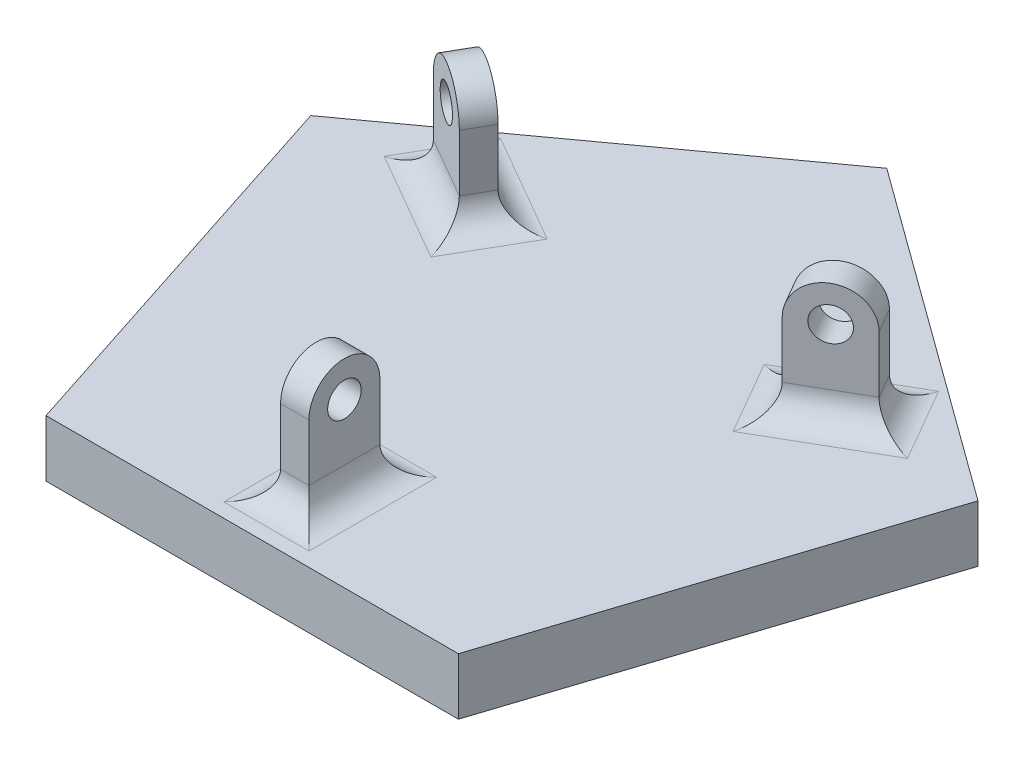
ISO-10303-21;
HEADER;
FILE_DESCRIPTION(('STEP AP214'),'2;1');
FILE_NAME('part.step','',(''),(''),'','','');
FILE_SCHEMA(('AUTOMOTIVE_DESIGN { 1 0 10303 214 1 1 1 1 }'));
ENDSEC;
DATA;
#1=APPLICATION_CONTEXT('core data for automotive mechanical design processes');
#2=APPLICATION_PROTOCOL_DEFINITION('international standard','automotive_design',2000,#1);
#3=PRODUCT_CONTEXT('',#1,'mechanical');
#4=PRODUCT('Part','Part','',(#3));
#5=PRODUCT_RELATED_PRODUCT_CATEGORY('part','',(#4));
#6=PRODUCT_DEFINITION_FORMATION('','',#4);
#7=PRODUCT_DEFINITION_CONTEXT('part definition',#1,'design');
#8=PRODUCT_DEFINITION('design','',#6,#7);
#9=PRODUCT_DEFINITION_SHAPE('','',#8);
#10=(LENGTH_UNIT() NAMED_UNIT(*) SI_UNIT(.MILLI.,.METRE.));
#11=(NAMED_UNIT(*) PLANE_ANGLE_UNIT() SI_UNIT($,.RADIAN.));
#12=(NAMED_UNIT(*) SI_UNIT($,.STERADIAN.) SOLID_ANGLE_UNIT());
#13=UNCERTAINTY_MEASURE_WITH_UNIT(LENGTH_MEASURE(1.E-05),#10,'distance_accuracy_value','');
#14=(GEOMETRIC_REPRESENTATION_CONTEXT(3) GLOBAL_UNCERTAINTY_ASSIGNED_CONTEXT((#13)) GLOBAL_UNIT_ASSIGNED_CONTEXT((#10,
#11,#12)) REPRESENTATION_CONTEXT('',''));
#15=CARTESIAN_POINT('',(0.,0.,0.));
#16=DIRECTION('',(0.,0.,1.));
#17=DIRECTION('',(1.,0.,0.));
#18=AXIS2_PLACEMENT_3D('',#15,#16,#17);
#19=CARTESIAN_POINT('',(0.,5.08,0.));
#20=DIRECTION('',(0.,1.,0.));
#21=DIRECTION('',(0.,0.,1.));
#22=AXIS2_PLACEMENT_3D('',#19,#20,#21);
#23=PLANE('',#22);
#24=DIRECTION('',(0.866025403784443,0.,0.499999999999992));
#25=VECTOR('',#24,1.);
#26=CARTESIAN_POINT('',(2.21276696458781,5.08,-3.83262480797613));
#27=LINE('',#26,#25);
#28=CARTESIAN_POINT('',(-19.6077269224943,5.08,-16.4306928275333));
#29=VERTEX_POINT('',#28);
#30=CARTESIAN_POINT('',(-9.70905655723815,5.08,-10.7156928275334));
#31=VERTEX_POINT('',#30);
#32=EDGE_CURVE('E463',#29,#31,#27,.T.);
#33=ORIENTED_EDGE('',*,*,#32,.T.);
#34=DIRECTION('',(-0.499999999999992,0.,0.866025403784443));
#35=VECTOR('',#34,1.);
#36=CARTESIAN_POINT('',(-11.921823521826,5.08,-6.88306801955729));
#37=LINE('',#36,#35);
#38=CARTESIAN_POINT('',(-13.5190565572381,5.08,-4.11657925069596));
#39=VERTEX_POINT('',#38);
#40=EDGE_CURVE('E466',#31,#39,#37,.T.);
#41=ORIENTED_EDGE('',*,*,#40,.T.);
#42=DIRECTION('',(0.866025403784443,0.,0.499999999999992));
#43=VECTOR('',#42,1.);
#44=CARTESIAN_POINT('',(-21.2180223968818,5.08,-8.56157925069589));
#45=LINE('',#44,#43);
#46=CARTESIAN_POINT('',(-23.4177269224943,5.08,-9.83157925069587));
#47=VERTEX_POINT('',#46);
#48=EDGE_CURVE('E444',#39,#47,#45,.F.);
#49=ORIENTED_EDGE('',*,*,#48,.T.);
#50=DIRECTION('',(-0.499999999999992,0.,0.866025403784443));
#51=VECTOR('',#50,1.);
#52=CARTESIAN_POINT('',(-21.8204938870821,5.08,-12.5980680195572));
#53=LINE('',#52,#51);
#54=EDGE_CURVE('E460',#47,#29,#53,.F.);
#55=ORIENTED_EDGE('',*,*,#54,.T.);
#56=EDGE_LOOP('',(#33,#41,#49,#55));
#57=FACE_BOUND('',#56,.T.);
#58=DIRECTION('',(-0.866025403784436,0.,0.500000000000004));
#59=VECTOR('',#58,1.);
#60=CARTESIAN_POINT('',(1.59723303541216,5.08,2.7664887688613));
#61=LINE('',#60,#59);
#62=CARTESIAN_POINT('',(23.4177269224941,5.08,-9.8315792506962));
#63=VERTEX_POINT('',#62);
#64=CARTESIAN_POINT('',(13.519056557238,5.08,-4.11657925069616));
#65=VERTEX_POINT('',#64);
#66=EDGE_CURVE('E424',#63,#65,#61,.T.);
#67=ORIENTED_EDGE('',*,*,#66,.T.);
#68=DIRECTION('',(-0.500000000000004,0.,-0.866025403784436));
#69=VECTOR('',#68,1.);
#70=CARTESIAN_POINT('',(11.9218235218259,5.08,-6.88306801955745));
#71=LINE('',#70,#69);
#72=CARTESIAN_POINT('',(9.70905655723801,5.08,-10.7156928275336));
#73=VERTEX_POINT('',#72);
#74=EDGE_CURVE('E427',#65,#73,#71,.T.);
#75=ORIENTED_EDGE('',*,*,#74,.T.);
#76=DIRECTION('',(-0.866025403784436,0.,0.500000000000004));
#77=VECTOR('',#76,1.);
#78=CARTESIAN_POINT('',(17.4080223968816,5.08,-15.1606928275336));
#79=LINE('',#78,#77);
#80=CARTESIAN_POINT('',(19.6077269224941,5.08,-16.4306928275336));
#81=VERTEX_POINT('',#80);
#82=EDGE_CURVE('E406',#73,#81,#79,.F.);
#83=ORIENTED_EDGE('',*,*,#82,.T.);
#84=DIRECTION('',(-0.500000000000004,0.,-0.866025403784436));
#85=VECTOR('',#84,1.);
#86=CARTESIAN_POINT('',(21.820493887082,5.08,-12.5980680195575));
#87=LINE('',#86,#85);
#88=EDGE_CURVE('E421',#81,#63,#87,.F.);
#89=ORIENTED_EDGE('',*,*,#88,.T.);
#90=EDGE_LOOP('',(#67,#75,#83,#89));
#91=FACE_BOUND('',#90,.T.);
#92=DIRECTION('',(0.,0.,-1.));
#93=VECTOR('',#92,1.);
#94=CARTESIAN_POINT('',(-3.81,5.08,0.));
#95=LINE('',#94,#93);
#96=CARTESIAN_POINT('',(-3.81,5.08,24.13));
#97=VERTEX_POINT('',#96);
#98=CARTESIAN_POINT('',(-3.81,5.08,12.7));
#99=VERTEX_POINT('',#98);
#100=EDGE_CURVE('E386',#97,#99,#95,.T.);
#101=ORIENTED_EDGE('',*,*,#100,.T.);
#102=DIRECTION('',(1.,0.,0.));
#103=VECTOR('',#102,1.);
#104=CARTESIAN_POINT('',(0.,5.08,12.7));
#105=LINE('',#104,#103);
#106=CARTESIAN_POINT('',(3.81,5.08,12.7));
#107=VERTEX_POINT('',#106);
#108=EDGE_CURVE('E389',#99,#107,#105,.T.);
#109=ORIENTED_EDGE('',*,*,#108,.T.);
#110=DIRECTION('',(0.,0.,-1.));
#111=VECTOR('',#110,1.);
#112=CARTESIAN_POINT('',(3.81,5.08,21.59));
#113=LINE('',#112,#111);
#114=CARTESIAN_POINT('',(3.81,5.08,24.13));
#115=VERTEX_POINT('',#114);
#116=EDGE_CURVE('E380',#107,#115,#113,.F.);
#117=ORIENTED_EDGE('',*,*,#116,.T.);
#118=DIRECTION('',(1.,0.,0.));
#119=VECTOR('',#118,1.);
#120=CARTESIAN_POINT('',(0.,5.08,24.13));
#121=LINE('',#120,#119);
#122=EDGE_CURVE('E383',#115,#97,#121,.F.);
#123=ORIENTED_EDGE('',*,*,#122,.T.);
#124=EDGE_LOOP('',(#101,#109,#117,#123));
#125=FACE_BOUND('',#124,.T.);
#126=DIRECTION('',(0.309016994374947,0.,0.951056516295154));
#127=VECTOR('',#126,1.);
#128=CARTESIAN_POINT('',(-24.1568355138969,5.08,7.84903165712366));
#129=LINE('',#128,#127);
#130=CARTESIAN_POINT('',(-29.8594908164576,5.08,-9.70193668575268));
#131=VERTEX_POINT('',#130);
#132=CARTESIAN_POINT('',(-18.4541802113362,5.08,25.4));
#133=VERTEX_POINT('',#132);
#134=EDGE_CURVE('E329',#131,#133,#129,.T.);
#135=ORIENTED_EDGE('',*,*,#134,.T.);
#136=DIRECTION('',(1.,0.,0.));
#137=VECTOR('',#136,1.);
#138=CARTESIAN_POINT('',(0.,5.08,25.4));
#139=LINE('',#138,#137);
#140=CARTESIAN_POINT('',(18.4541802113362,5.08,25.4));
#141=VERTEX_POINT('',#140);
#142=EDGE_CURVE('E333',#133,#141,#139,.T.);
#143=ORIENTED_EDGE('',*,*,#142,.T.);
#144=DIRECTION('',(0.309016994374947,0.,-0.951056516295154));
#145=VECTOR('',#144,1.);
#146=CARTESIAN_POINT('',(24.1568355138969,5.08,7.84903165712367));
#147=LINE('',#146,#145);
#148=CARTESIAN_POINT('',(29.8594908164576,5.08,-9.70193668575266));
#149=VERTEX_POINT('',#148);
#150=EDGE_CURVE('E337',#141,#149,#147,.T.);
#151=ORIENTED_EDGE('',*,*,#150,.T.);
#152=DIRECTION('',(-0.809016994374948,0.,-0.587785252292473));
#153=VECTOR('',#152,1.);
#154=CARTESIAN_POINT('',(14.9297454082288,5.08,-20.5490316571237));
#155=LINE('',#154,#153);
#156=CARTESIAN_POINT('',(0.,5.08,-31.3961266284946));
#157=VERTEX_POINT('',#156);
#158=EDGE_CURVE('E340',#149,#157,#155,.T.);
#159=ORIENTED_EDGE('',*,*,#158,.T.);
#160=DIRECTION('',(-0.809016994374948,0.,0.587785252292473));
#161=VECTOR('',#160,1.);
#162=CARTESIAN_POINT('',(-14.9297454082288,5.08,-20.5490316571237));
#163=LINE('',#162,#161);
#164=EDGE_CURVE('E343',#157,#131,#163,.T.);
#165=ORIENTED_EDGE('',*,*,#164,.T.);
#166=EDGE_LOOP('',(#135,#143,#151,#159,#165));
#167=FACE_BOUND('',#166,.T.);
#168=ADVANCED_FACE('F46',(#57,#91,#125,#167),#23,.T.);
#169=CARTESIAN_POINT('',(-24.1568355138969,5.08,7.84903165712366));
#170=DIRECTION('',(0.951056516295154,0.,-0.309016994374947));
#171=DIRECTION('',(-0.309016994374947,0.,-0.951056516295154));
#172=AXIS2_PLACEMENT_3D('',#169,#170,#171);
#173=PLANE('',#172);
#174=DIRECTION('',(0.309016994374947,0.,0.951056516295154));
#175=VECTOR('',#174,1.);
#176=CARTESIAN_POINT('',(-24.1568355138969,0.,7.84903165712366));
#177=LINE('',#176,#175);
#178=CARTESIAN_POINT('',(-29.8594908164576,0.,-9.70193668575268));
#179=VERTEX_POINT('',#178);
#180=CARTESIAN_POINT('',(-18.4541802113362,0.,25.4));
#181=VERTEX_POINT('',#180);
#182=EDGE_CURVE('E326',#179,#181,#177,.T.);
#183=ORIENTED_EDGE('',*,*,#182,.T.);
#184=DIRECTION('',(0.,-1.,0.));
#185=VECTOR('',#184,1.);
#186=CARTESIAN_POINT('',(-18.4541802113362,5.08,25.4));
#187=LINE('',#186,#185);
#188=EDGE_CURVE('E376',#133,#181,#187,.T.);
#189=ORIENTED_EDGE('',*,*,#188,.F.);
#190=ORIENTED_EDGE('',*,*,#134,.F.);
#191=DIRECTION('',(0.,-1.,0.));
#192=VECTOR('',#191,1.);
#193=CARTESIAN_POINT('',(-29.8594908164576,5.08,-9.70193668575268));
#194=LINE('',#193,#192);
#195=EDGE_CURVE('E346',#131,#179,#194,.T.);
#196=ORIENTED_EDGE('',*,*,#195,.T.);
#197=EDGE_LOOP('',(#183,#189,#190,#196));
#198=FACE_BOUND('',#197,.T.);
#199=ADVANCED_FACE('F518',(#198),#173,.F.);
#200=CARTESIAN_POINT('',(0.,5.08,25.4));
#201=DIRECTION('',(0.,0.,-1.));
#202=DIRECTION('',(-1.,0.,0.));
#203=AXIS2_PLACEMENT_3D('',#200,#201,#202);
#204=PLANE('',#203);
#205=DIRECTION('',(1.,0.,0.));
#206=VECTOR('',#205,1.);
#207=CARTESIAN_POINT('',(0.,0.,25.4));
#208=LINE('',#207,#206);
#209=CARTESIAN_POINT('',(18.4541802113362,0.,25.4));
#210=VERTEX_POINT('',#209);
#211=EDGE_CURVE('E350',#181,#210,#208,.T.);
#212=ORIENTED_EDGE('',*,*,#211,.T.);
#213=DIRECTION('',(0.,-1.,0.));
#214=VECTOR('',#213,1.);
#215=CARTESIAN_POINT('',(18.4541802113362,5.08,25.4));
#216=LINE('',#215,#214);
#217=EDGE_CURVE('E372',#141,#210,#216,.T.);
#218=ORIENTED_EDGE('',*,*,#217,.F.);
#219=ORIENTED_EDGE('',*,*,#142,.F.);
#220=ORIENTED_EDGE('',*,*,#188,.T.);
#221=EDGE_LOOP('',(#212,#218,#219,#220));
#222=FACE_BOUND('',#221,.T.);
#223=ADVANCED_FACE('F526',(#222),#204,.F.);
#224=CARTESIAN_POINT('',(24.1568355138969,5.08,7.84903165712367));
#225=DIRECTION('',(-0.951056516295154,0.,-0.309016994374947));
#226=DIRECTION('',(-0.309016994374947,0.,0.951056516295154));
#227=AXIS2_PLACEMENT_3D('',#224,#225,#226);
#228=PLANE('',#227);
#229=DIRECTION('',(0.309016994374947,0.,-0.951056516295154));
#230=VECTOR('',#229,1.);
#231=CARTESIAN_POINT('',(24.1568355138969,0.,7.84903165712367));
#232=LINE('',#231,#230);
#233=CARTESIAN_POINT('',(29.8594908164576,0.,-9.70193668575266));
#234=VERTEX_POINT('',#233);
#235=EDGE_CURVE('E353',#210,#234,#232,.T.);
#236=ORIENTED_EDGE('',*,*,#235,.T.);
#237=DIRECTION('',(0.,-1.,0.));
#238=VECTOR('',#237,1.);
#239=CARTESIAN_POINT('',(29.8594908164576,5.08,-9.70193668575266));
#240=LINE('',#239,#238);
#241=EDGE_CURVE('E368',#149,#234,#240,.T.);
#242=ORIENTED_EDGE('',*,*,#241,.F.);
#243=ORIENTED_EDGE('',*,*,#150,.F.);
#244=ORIENTED_EDGE('',*,*,#217,.T.);
#245=EDGE_LOOP('',(#236,#242,#243,#244));
#246=FACE_BOUND('',#245,.T.);
#247=ADVANCED_FACE('F546',(#246),#228,.F.);
#248=CARTESIAN_POINT('',(14.9297454082288,5.08,-20.5490316571237));
#249=DIRECTION('',(-0.587785252292473,0.,0.809016994374948));
#250=DIRECTION('',(0.809016994374948,0.,0.587785252292473));
#251=AXIS2_PLACEMENT_3D('',#248,#249,#250);
#252=PLANE('',#251);
#253=DIRECTION('',(-0.809016994374948,0.,-0.587785252292473));
#254=VECTOR('',#253,1.);
#255=CARTESIAN_POINT('',(14.9297454082288,0.,-20.5490316571237));
#256=LINE('',#255,#254);
#257=CARTESIAN_POINT('',(0.,0.,-31.3961266284946));
#258=VERTEX_POINT('',#257);
#259=EDGE_CURVE('E356',#234,#258,#256,.T.);
#260=ORIENTED_EDGE('',*,*,#259,.T.);
#261=DIRECTION('',(0.,-1.,0.));
#262=VECTOR('',#261,1.);
#263=CARTESIAN_POINT('',(0.,5.08,-31.3961266284946));
#264=LINE('',#263,#262);
#265=EDGE_CURVE('E364',#157,#258,#264,.T.);
#266=ORIENTED_EDGE('',*,*,#265,.F.);
#267=ORIENTED_EDGE('',*,*,#158,.F.);
#268=ORIENTED_EDGE('',*,*,#241,.T.);
#269=EDGE_LOOP('',(#260,#266,#267,#268));
#270=FACE_BOUND('',#269,.T.);
#271=ADVANCED_FACE('F542',(#270),#252,.F.);
#272=CARTESIAN_POINT('',(-14.9297454082288,5.08,-20.5490316571237));
#273=DIRECTION('',(0.587785252292473,0.,0.809016994374948));
#274=DIRECTION('',(0.809016994374948,0.,-0.587785252292473));
#275=AXIS2_PLACEMENT_3D('',#272,#273,#274);
#276=PLANE('',#275);
#277=DIRECTION('',(-0.809016994374948,0.,0.587785252292473));
#278=VECTOR('',#277,1.);
#279=CARTESIAN_POINT('',(-14.9297454082288,0.,-20.5490316571237));
#280=LINE('',#279,#278);
#281=EDGE_CURVE('E334',#258,#179,#280,.T.);
#282=ORIENTED_EDGE('',*,*,#281,.T.);
#283=ORIENTED_EDGE('',*,*,#195,.F.);
#284=ORIENTED_EDGE('',*,*,#164,.F.);
#285=ORIENTED_EDGE('',*,*,#265,.T.);
#286=EDGE_LOOP('',(#282,#283,#284,#285));
#287=FACE_BOUND('',#286,.T.);
#288=ADVANCED_FACE('F538',(#287),#276,.F.);
#289=CARTESIAN_POINT('',(0.,0.,0.));
#290=DIRECTION('',(0.,1.,0.));
#291=DIRECTION('',(0.,0.,1.));
#292=AXIS2_PLACEMENT_3D('',#289,#290,#291);
#293=PLANE('',#292);
#294=ORIENTED_EDGE('',*,*,#182,.F.);
#295=ORIENTED_EDGE('',*,*,#281,.F.);
#296=ORIENTED_EDGE('',*,*,#259,.F.);
#297=ORIENTED_EDGE('',*,*,#235,.F.);
#298=ORIENTED_EDGE('',*,*,#211,.F.);
#299=EDGE_LOOP('',(#294,#295,#296,#297,#298));
#300=FACE_BOUND('',#299,.T.);
#301=ADVANCED_FACE('F534',(#300),#293,.F.);
#302=CARTESIAN_POINT('',(-1.27,0.,15.24));
#303=DIRECTION('',(0.,0.,1.));
#304=DIRECTION('',(0.,-1.,0.));
#305=AXIS2_PLACEMENT_3D('',#302,#303,#304);
#306=PLANE('',#305);
#307=DIRECTION('',(0.,-1.,0.));
#308=VECTOR('',#307,1.);
#309=CARTESIAN_POINT('',(1.27,0.,15.24));
#310=LINE('',#309,#308);
#311=CARTESIAN_POINT('',(1.27,12.7,15.24));
#312=VERTEX_POINT('',#311);
#313=CARTESIAN_POINT('',(1.27,7.62,15.24));
#314=VERTEX_POINT('',#313);
#315=EDGE_CURVE('E294',#312,#314,#310,.T.);
#316=ORIENTED_EDGE('',*,*,#315,.T.);
#317=DIRECTION('',(1.,0.,0.));
#318=VECTOR('',#317,1.);
#319=CARTESIAN_POINT('',(-1.27,7.62,15.24));
#320=LINE('',#319,#318);
#321=CARTESIAN_POINT('',(-1.27,7.62,15.24));
#322=VERTEX_POINT('',#321);
#323=EDGE_CURVE('E393',#314,#322,#320,.F.);
#324=ORIENTED_EDGE('',*,*,#323,.T.);
#325=DIRECTION('',(0.,-1.,0.));
#326=VECTOR('',#325,1.);
#327=CARTESIAN_POINT('',(-1.27,0.,15.24));
#328=LINE('',#327,#326);
#329=CARTESIAN_POINT('',(-1.27,12.7,15.24));
#330=VERTEX_POINT('',#329);
#331=EDGE_CURVE('E310',#330,#322,#328,.T.);
#332=ORIENTED_EDGE('',*,*,#331,.F.);
#333=DIRECTION('',(1.,0.,0.));
#334=VECTOR('',#333,1.);
#335=CARTESIAN_POINT('',(-1.27,12.7,15.24));
#336=LINE('',#335,#334);
#337=EDGE_CURVE('E321',#330,#312,#336,.T.);
#338=ORIENTED_EDGE('',*,*,#337,.T.);
#339=EDGE_LOOP('',(#316,#324,#332,#338));
#340=FACE_BOUND('',#339,.T.);
#341=ADVANCED_FACE('F537',(#340),#306,.F.);
#342=CARTESIAN_POINT('',(-1.27,0.,21.59));
#343=DIRECTION('',(0.,0.,-1.));
#344=DIRECTION('',(0.,1.,0.));
#345=AXIS2_PLACEMENT_3D('',#342,#343,#344);
#346=PLANE('',#345);
#347=DIRECTION('',(0.,1.,0.));
#348=VECTOR('',#347,1.);
#349=CARTESIAN_POINT('',(-1.27,0.,21.59));
#350=LINE('',#349,#348);
#351=CARTESIAN_POINT('',(-1.27,7.62,21.59));
#352=VERTEX_POINT('',#351);
#353=CARTESIAN_POINT('',(-1.27,12.7,21.59));
#354=VERTEX_POINT('',#353);
#355=EDGE_CURVE('E318',#352,#354,#350,.T.);
#356=ORIENTED_EDGE('',*,*,#355,.F.);
#357=DIRECTION('',(1.,0.,0.));
#358=VECTOR('',#357,1.);
#359=CARTESIAN_POINT('',(-1.27,7.62,21.59));
#360=LINE('',#359,#358);
#361=CARTESIAN_POINT('',(1.27,7.62,21.59));
#362=VERTEX_POINT('',#361);
#363=EDGE_CURVE('E400',#352,#362,#360,.T.);
#364=ORIENTED_EDGE('',*,*,#363,.T.);
#365=DIRECTION('',(0.,1.,0.));
#366=VECTOR('',#365,1.);
#367=CARTESIAN_POINT('',(1.27,0.,21.59));
#368=LINE('',#367,#366);
#369=CARTESIAN_POINT('',(1.27,12.7,21.59));
#370=VERTEX_POINT('',#369);
#371=EDGE_CURVE('E303',#362,#370,#368,.T.);
#372=ORIENTED_EDGE('',*,*,#371,.T.);
#373=DIRECTION('',(1.,0.,0.));
#374=VECTOR('',#373,1.);
#375=CARTESIAN_POINT('',(-1.27,12.7,21.59));
#376=LINE('',#375,#374);
#377=EDGE_CURVE('E322',#354,#370,#376,.T.);
#378=ORIENTED_EDGE('',*,*,#377,.F.);
#379=EDGE_LOOP('',(#356,#364,#372,#378));
#380=FACE_BOUND('',#379,.T.);
#381=ADVANCED_FACE('F779',(#380),#346,.F.);
#382=CARTESIAN_POINT('',(-1.27,12.7,18.415));
#383=DIRECTION('',(1.,0.,0.));
#384=DIRECTION('',(0.,0.,-1.));
#385=AXIS2_PLACEMENT_3D('',#382,#383,#384);
#386=CYLINDRICAL_SURFACE('',#385,1.5);
#387=CARTESIAN_POINT('',(-1.27,12.7,18.415));
#388=DIRECTION('',(1.,0.,0.));
#389=DIRECTION('',(0.,0.,-1.));
#390=AXIS2_PLACEMENT_3D('',#387,#388,#389);
#391=CIRCLE('',#390,1.5);
#392=CARTESIAN_POINT('',(-1.27,12.7,16.915));
#393=VERTEX_POINT('',#392);
#394=EDGE_CURVE('E306',#393,#393,#391,.T.);
#395=ORIENTED_EDGE('',*,*,#394,.F.);
#396=EDGE_LOOP('',(#395));
#397=FACE_BOUND('',#396,.T.);
#398=CARTESIAN_POINT('',(1.27,12.7,18.415));
#399=DIRECTION('',(1.,0.,0.));
#400=DIRECTION('',(0.,0.,-1.));
#401=AXIS2_PLACEMENT_3D('',#398,#399,#400);
#402=CIRCLE('',#401,1.5);
#403=CARTESIAN_POINT('',(1.27,12.7,16.915));
#404=VERTEX_POINT('',#403);
#405=EDGE_CURVE('E290',#404,#404,#402,.T.);
#406=ORIENTED_EDGE('',*,*,#405,.T.);
#407=EDGE_LOOP('',(#406));
#408=FACE_BOUND('',#407,.T.);
#409=ADVANCED_FACE('F532',(#397,#408),#386,.F.);
#410=CARTESIAN_POINT('',(-1.27,12.7,18.415));
#411=DIRECTION('',(1.,0.,0.));
#412=DIRECTION('',(0.,0.,-1.));
#413=AXIS2_PLACEMENT_3D('',#410,#411,#412);
#414=CYLINDRICAL_SURFACE('',#413,3.175);
#415=ORIENTED_EDGE('',*,*,#377,.T.);
#416=CARTESIAN_POINT('',(1.27,12.7,18.415));
#417=DIRECTION('',(1.,0.,0.));
#418=DIRECTION('',(0.,0.,-1.));
#419=AXIS2_PLACEMENT_3D('',#416,#417,#418);
#420=CIRCLE('',#419,3.175);
#421=EDGE_CURVE('E299',#312,#370,#420,.T.);
#422=ORIENTED_EDGE('',*,*,#421,.F.);
#423=ORIENTED_EDGE('',*,*,#337,.F.);
#424=CARTESIAN_POINT('',(-1.27,12.7,18.415));
#425=DIRECTION('',(1.,0.,0.));
#426=DIRECTION('',(0.,0.,-1.));
#427=AXIS2_PLACEMENT_3D('',#424,#425,#426);
#428=CIRCLE('',#427,3.175);
#429=EDGE_CURVE('E314',#330,#354,#428,.T.);
#430=ORIENTED_EDGE('',*,*,#429,.T.);
#431=EDGE_LOOP('',(#415,#422,#423,#430));
#432=FACE_BOUND('',#431,.T.);
#433=ADVANCED_FACE('F761',(#432),#414,.T.);
#434=CARTESIAN_POINT('',(-1.27,0.,0.));
#435=DIRECTION('',(1.,0.,0.));
#436=DIRECTION('',(0.,0.,-1.));
#437=AXIS2_PLACEMENT_3D('',#434,#435,#436);
#438=PLANE('',#437);
#439=ORIENTED_EDGE('',*,*,#394,.T.);
#440=EDGE_LOOP('',(#439));
#441=FACE_BOUND('',#440,.T.);
#442=ORIENTED_EDGE('',*,*,#331,.T.);
#443=DIRECTION('',(0.,0.,-1.));
#444=VECTOR('',#443,1.);
#445=CARTESIAN_POINT('',(-1.27,7.62,0.));
#446=LINE('',#445,#444);
#447=EDGE_CURVE('E397',#322,#352,#446,.F.);
#448=ORIENTED_EDGE('',*,*,#447,.T.);
#449=ORIENTED_EDGE('',*,*,#355,.T.);
#450=ORIENTED_EDGE('',*,*,#429,.F.);
#451=EDGE_LOOP('',(#442,#448,#449,#450));
#452=FACE_BOUND('',#451,.T.);
#453=ADVANCED_FACE('F750',(#441,#452),#438,.F.);
#454=CARTESIAN_POINT('',(1.27,0.,0.));
#455=DIRECTION('',(1.,0.,0.));
#456=DIRECTION('',(0.,0.,-1.));
#457=AXIS2_PLACEMENT_3D('',#454,#455,#456);
#458=PLANE('',#457);
#459=ORIENTED_EDGE('',*,*,#405,.F.);
#460=EDGE_LOOP('',(#459));
#461=FACE_BOUND('',#460,.T.);
#462=ORIENTED_EDGE('',*,*,#371,.F.);
#463=DIRECTION('',(0.,0.,-1.));
#464=VECTOR('',#463,1.);
#465=CARTESIAN_POINT('',(1.27,7.62,15.24));
#466=LINE('',#465,#464);
#467=EDGE_CURVE('E403',#362,#314,#466,.T.);
#468=ORIENTED_EDGE('',*,*,#467,.T.);
#469=ORIENTED_EDGE('',*,*,#315,.F.);
#470=ORIENTED_EDGE('',*,*,#421,.T.);
#471=EDGE_LOOP('',(#462,#468,#469,#470));
#472=FACE_BOUND('',#471,.T.);
#473=ADVANCED_FACE('F569',(#461,#472),#458,.T.);
#474=CARTESIAN_POINT('',(-1.27,7.62,24.13));
#475=DIRECTION('',(1.,0.,0.));
#476=DIRECTION('',(0.,0.,-1.));
#477=AXIS2_PLACEMENT_3D('',#474,#475,#476);
#478=CYLINDRICAL_SURFACE('',#477,2.54);
#479=CARTESIAN_POINT('',(3.81,7.62,24.13));
#480=DIRECTION('',(-0.707106781186547,0.,0.707106781186547));
#481=DIRECTION('',(0.707106781186547,0.,0.707106781186547));
#482=AXIS2_PLACEMENT_3D('',#479,#480,#481);
#483=ELLIPSE('',#482,3.59210244842766,2.54);
#484=EDGE_CURVE('E412',#362,#115,#483,.T.);
#485=ORIENTED_EDGE('',*,*,#484,.F.);
#486=ORIENTED_EDGE('',*,*,#363,.F.);
#487=CARTESIAN_POINT('',(-3.81,7.62,24.13));
#488=DIRECTION('',(0.707106781186547,0.,0.707106781186547));
#489=DIRECTION('',(0.707106781186547,0.,-0.707106781186547));
#490=AXIS2_PLACEMENT_3D('',#487,#488,#489);
#491=ELLIPSE('',#490,3.59210244842766,2.54);
#492=EDGE_CURVE('E295',#97,#352,#491,.T.);
#493=ORIENTED_EDGE('',*,*,#492,.F.);
#494=ORIENTED_EDGE('',*,*,#122,.F.);
#495=EDGE_LOOP('',(#485,#486,#493,#494));
#496=FACE_BOUND('',#495,.T.);
#497=ADVANCED_FACE('F565',(#496),#478,.F.);
#498=CARTESIAN_POINT('',(-3.81,7.62,0.));
#499=DIRECTION('',(0.,0.,-1.));
#500=DIRECTION('',(-1.,0.,0.));
#501=AXIS2_PLACEMENT_3D('',#498,#499,#500);
#502=CYLINDRICAL_SURFACE('',#501,2.54);
#503=ORIENTED_EDGE('',*,*,#492,.T.);
#504=ORIENTED_EDGE('',*,*,#447,.F.);
#505=CARTESIAN_POINT('',(-3.81,7.62,12.7));
#506=DIRECTION('',(0.707106781186547,0.,-0.707106781186547));
#507=DIRECTION('',(-0.707106781186547,0.,-0.707106781186547));
#508=AXIS2_PLACEMENT_3D('',#505,#506,#507);
#509=ELLIPSE('',#508,3.59210244842766,2.54);
#510=EDGE_CURVE('E409',#99,#322,#509,.F.);
#511=ORIENTED_EDGE('',*,*,#510,.F.);
#512=ORIENTED_EDGE('',*,*,#100,.F.);
#513=EDGE_LOOP('',(#503,#504,#511,#512));
#514=FACE_BOUND('',#513,.T.);
#515=ADVANCED_FACE('F561',(#514),#502,.F.);
#516=CARTESIAN_POINT('',(3.81,7.62,0.));
#517=DIRECTION('',(0.,0.,1.));
#518=DIRECTION('',(1.,0.,0.));
#519=AXIS2_PLACEMENT_3D('',#516,#517,#518);
#520=CYLINDRICAL_SURFACE('',#519,2.54);
#521=ORIENTED_EDGE('',*,*,#484,.T.);
#522=ORIENTED_EDGE('',*,*,#116,.F.);
#523=CARTESIAN_POINT('',(3.81,7.62,12.7));
#524=DIRECTION('',(0.707106781186547,0.,0.707106781186547));
#525=DIRECTION('',(-0.707106781186547,0.,0.707106781186547));
#526=AXIS2_PLACEMENT_3D('',#523,#524,#525);
#527=ELLIPSE('',#526,3.59210244842766,2.54);
#528=EDGE_CURVE('E287',#314,#107,#527,.T.);
#529=ORIENTED_EDGE('',*,*,#528,.F.);
#530=ORIENTED_EDGE('',*,*,#467,.F.);
#531=EDGE_LOOP('',(#521,#522,#529,#530));
#532=FACE_BOUND('',#531,.T.);
#533=ADVANCED_FACE('F557',(#532),#520,.F.);
#534=CARTESIAN_POINT('',(0.,7.62,12.7));
#535=DIRECTION('',(1.,0.,0.));
#536=DIRECTION('',(0.,0.,-1.));
#537=AXIS2_PLACEMENT_3D('',#534,#535,#536);
#538=CYLINDRICAL_SURFACE('',#537,2.54);
#539=ORIENTED_EDGE('',*,*,#510,.T.);
#540=ORIENTED_EDGE('',*,*,#323,.F.);
#541=ORIENTED_EDGE('',*,*,#528,.T.);
#542=ORIENTED_EDGE('',*,*,#108,.F.);
#543=EDGE_LOOP('',(#539,#540,#541,#542));
#544=FACE_BOUND('',#543,.T.);
#545=ADVANCED_FACE('F554',(#544),#538,.F.);
#546=CARTESIAN_POINT('',(14.4487610828505,0.,-7.58628377630864));
#547=DIRECTION('',(0.866025403784436,0.,-0.500000000000004));
#548=DIRECTION('',(-0.500000000000004,0.,-0.866025403784436));
#549=AXIS2_PLACEMENT_3D('',#546,#547,#548);
#550=PLANE('',#549);
#551=DIRECTION('',(0.,-1.,0.));
#552=VECTOR('',#551,1.);
#553=CARTESIAN_POINT('',(13.1787610828505,0.,-9.7859883019211));
#554=LINE('',#553,#552);
#555=CARTESIAN_POINT('',(13.1787610828505,12.7,-9.7859883019211));
#556=VERTEX_POINT('',#555);
#557=CARTESIAN_POINT('',(13.1787610828505,7.62,-9.7859883019211));
#558=VERTEX_POINT('',#557);
#559=EDGE_CURVE('E256',#556,#558,#554,.T.);
#560=ORIENTED_EDGE('',*,*,#559,.T.);
#561=DIRECTION('',(-0.500000000000004,0.,-0.866025403784436));
#562=VECTOR('',#561,1.);
#563=CARTESIAN_POINT('',(14.4487610828505,7.62,-7.58628377630863));
#564=LINE('',#563,#562);
#565=CARTESIAN_POINT('',(14.4487610828505,7.62,-7.58628377630863));
#566=VERTEX_POINT('',#565);
#567=EDGE_CURVE('E431',#558,#566,#564,.F.);
#568=ORIENTED_EDGE('',*,*,#567,.T.);
#569=DIRECTION('',(0.,-1.,0.));
#570=VECTOR('',#569,1.);
#571=CARTESIAN_POINT('',(14.4487610828505,0.,-7.58628377630864));
#572=LINE('',#571,#570);
#573=CARTESIAN_POINT('',(14.4487610828505,12.7,-7.58628377630863));
#574=VERTEX_POINT('',#573);
#575=EDGE_CURVE('E271',#574,#566,#572,.T.);
#576=ORIENTED_EDGE('',*,*,#575,.F.);
#577=DIRECTION('',(-0.500000000000004,0.,-0.866025403784436));
#578=VECTOR('',#577,1.);
#579=CARTESIAN_POINT('',(14.4487610828505,12.7,-7.58628377630863));
#580=LINE('',#579,#578);
#581=EDGE_CURVE('E282',#574,#556,#580,.T.);
#582=ORIENTED_EDGE('',*,*,#581,.T.);
#583=EDGE_LOOP('',(#560,#568,#576,#582));
#584=FACE_BOUND('',#583,.T.);
#585=ADVANCED_FACE('F556',(#584),#550,.F.);
#586=CARTESIAN_POINT('',(19.9480223968817,0.,-10.7612837763087));
#587=DIRECTION('',(-0.866025403784436,0.,0.500000000000004));
#588=DIRECTION('',(0.500000000000004,0.,0.866025403784436));
#589=AXIS2_PLACEMENT_3D('',#586,#587,#588);
#590=PLANE('',#589);
#591=DIRECTION('',(0.,1.,0.));
#592=VECTOR('',#591,1.);
#593=CARTESIAN_POINT('',(19.9480223968817,0.,-10.7612837763087));
#594=LINE('',#593,#592);
#595=CARTESIAN_POINT('',(19.9480223968817,7.62,-10.7612837763087));
#596=VERTEX_POINT('',#595);
#597=CARTESIAN_POINT('',(19.9480223968817,12.7,-10.7612837763087));
#598=VERTEX_POINT('',#597);
#599=EDGE_CURVE('E279',#596,#598,#594,.T.);
#600=ORIENTED_EDGE('',*,*,#599,.F.);
#601=DIRECTION('',(-0.500000000000004,0.,-0.866025403784436));
#602=VECTOR('',#601,1.);
#603=CARTESIAN_POINT('',(19.9480223968817,7.62,-10.7612837763087));
#604=LINE('',#603,#602);
#605=CARTESIAN_POINT('',(18.6780223968817,7.62,-12.9609883019211));
#606=VERTEX_POINT('',#605);
#607=EDGE_CURVE('E438',#596,#606,#604,.T.);
#608=ORIENTED_EDGE('',*,*,#607,.T.);
#609=DIRECTION('',(0.,1.,0.));
#610=VECTOR('',#609,1.);
#611=CARTESIAN_POINT('',(18.6780223968817,0.,-12.9609883019211));
#612=LINE('',#611,#610);
#613=CARTESIAN_POINT('',(18.6780223968817,12.7,-12.9609883019211));
#614=VERTEX_POINT('',#613);
#615=EDGE_CURVE('E264',#606,#614,#612,.T.);
#616=ORIENTED_EDGE('',*,*,#615,.T.);
#617=DIRECTION('',(-0.500000000000004,0.,-0.866025403784436));
#618=VECTOR('',#617,1.);
#619=CARTESIAN_POINT('',(19.9480223968817,12.7,-10.7612837763087));
#620=LINE('',#619,#618);
#621=EDGE_CURVE('E283',#598,#614,#620,.T.);
#622=ORIENTED_EDGE('',*,*,#621,.F.);
#623=EDGE_LOOP('',(#600,#608,#616,#622));
#624=FACE_BOUND('',#623,.T.);
#625=ADVANCED_FACE('F694',(#624),#590,.F.);
#626=CARTESIAN_POINT('',(17.1983917398661,12.7,-9.17378377630864));
#627=DIRECTION('',(-0.500000000000004,0.,-0.866025403784436));
#628=DIRECTION('',(-0.866025403784436,0.,0.500000000000004));
#629=AXIS2_PLACEMENT_3D('',#626,#627,#628);
#630=CYLINDRICAL_SURFACE('',#629,1.5);
#631=CARTESIAN_POINT('',(17.1983917398661,12.7,-9.17378377630864));
#632=DIRECTION('',(-0.500000000000004,0.,-0.866025403784436));
#633=DIRECTION('',(-0.866025403784436,0.,0.500000000000004));
#634=AXIS2_PLACEMENT_3D('',#631,#632,#633);
#635=CIRCLE('',#634,1.5);
#636=CARTESIAN_POINT('',(15.8993536341894,12.7,-8.42378377630864));
#637=VERTEX_POINT('',#636);
#638=EDGE_CURVE('E267',#637,#637,#635,.T.);
#639=ORIENTED_EDGE('',*,*,#638,.F.);
#640=EDGE_LOOP('',(#639));
#641=FACE_BOUND('',#640,.T.);
#642=CARTESIAN_POINT('',(15.9283917398661,12.7,-11.3734883019211));
#643=DIRECTION('',(-0.500000000000004,0.,-0.866025403784436));
#644=DIRECTION('',(-0.866025403784436,0.,0.500000000000004));
#645=AXIS2_PLACEMENT_3D('',#642,#643,#644);
#646=CIRCLE('',#645,1.5);
#647=CARTESIAN_POINT('',(14.6293536341894,12.7,-10.6234883019211));
#648=VERTEX_POINT('',#647);
#649=EDGE_CURVE('E251',#648,#648,#646,.T.);
#650=ORIENTED_EDGE('',*,*,#649,.T.);
#651=EDGE_LOOP('',(#650));
#652=FACE_BOUND('',#651,.T.);
#653=ADVANCED_FACE('F684',(#641,#652),#630,.F.);
#654=CARTESIAN_POINT('',(17.1983917398661,12.7,-9.17378377630864));
#655=DIRECTION('',(-0.500000000000004,0.,-0.866025403784436));
#656=DIRECTION('',(-0.866025403784436,0.,0.500000000000004));
#657=AXIS2_PLACEMENT_3D('',#654,#655,#656);
#658=CYLINDRICAL_SURFACE('',#657,3.175);
#659=ORIENTED_EDGE('',*,*,#621,.T.);
#660=CARTESIAN_POINT('',(15.9283917398661,12.7,-11.3734883019211));
#661=DIRECTION('',(-0.500000000000004,0.,-0.866025403784436));
#662=DIRECTION('',(-0.866025403784436,0.,0.500000000000004));
#663=AXIS2_PLACEMENT_3D('',#660,#661,#662);
#664=CIRCLE('',#663,3.175);
#665=EDGE_CURVE('E260',#556,#614,#664,.T.);
#666=ORIENTED_EDGE('',*,*,#665,.F.);
#667=ORIENTED_EDGE('',*,*,#581,.F.);
#668=CARTESIAN_POINT('',(17.1983917398661,12.7,-9.17378377630864));
#669=DIRECTION('',(-0.500000000000004,0.,-0.866025403784436));
#670=DIRECTION('',(-0.866025403784436,0.,0.500000000000004));
#671=AXIS2_PLACEMENT_3D('',#668,#669,#670);
#672=CIRCLE('',#671,3.175);
#673=EDGE_CURVE('E275',#574,#598,#672,.T.);
#674=ORIENTED_EDGE('',*,*,#673,.T.);
#675=EDGE_LOOP('',(#659,#666,#667,#674));
#676=FACE_BOUND('',#675,.T.);
#677=ADVANCED_FACE('F675',(#676),#658,.T.);
#678=CARTESIAN_POINT('',(1.2505339291757,0.,0.0337162236914235));
#679=DIRECTION('',(-0.500000000000004,0.,-0.866025403784436));
#680=DIRECTION('',(-0.866025403784436,0.,0.500000000000004));
#681=AXIS2_PLACEMENT_3D('',#678,#679,#680);
#682=PLANE('',#681);
#683=ORIENTED_EDGE('',*,*,#638,.T.);
#684=EDGE_LOOP('',(#683));
#685=FACE_BOUND('',#684,.T.);
#686=ORIENTED_EDGE('',*,*,#575,.T.);
#687=DIRECTION('',(-0.866025403784436,0.,0.500000000000004));
#688=VECTOR('',#687,1.);
#689=CARTESIAN_POINT('',(1.2505339291757,7.62,0.0337162236914235));
#690=LINE('',#689,#688);
#691=EDGE_CURVE('E435',#566,#596,#690,.F.);
#692=ORIENTED_EDGE('',*,*,#691,.T.);
#693=ORIENTED_EDGE('',*,*,#599,.T.);
#694=ORIENTED_EDGE('',*,*,#673,.F.);
#695=EDGE_LOOP('',(#686,#692,#693,#694));
#696=FACE_BOUND('',#695,.T.);
#697=ADVANCED_FACE('F664',(#685,#696),#682,.F.);
#698=CARTESIAN_POINT('',(-0.0194660708243133,0.,-2.16598830192104));
#699=DIRECTION('',(-0.500000000000004,0.,-0.866025403784436));
#700=DIRECTION('',(-0.866025403784436,0.,0.500000000000004));
#701=AXIS2_PLACEMENT_3D('',#698,#699,#700);
#702=PLANE('',#701);
#703=ORIENTED_EDGE('',*,*,#649,.F.);
#704=EDGE_LOOP('',(#703));
#705=FACE_BOUND('',#704,.T.);
#706=ORIENTED_EDGE('',*,*,#615,.F.);
#707=DIRECTION('',(-0.866025403784436,0.,0.500000000000004));
#708=VECTOR('',#707,1.);
#709=CARTESIAN_POINT('',(13.1787610828505,7.62,-9.7859883019211));
#710=LINE('',#709,#708);
#711=EDGE_CURVE('E441',#606,#558,#710,.T.);
#712=ORIENTED_EDGE('',*,*,#711,.T.);
#713=ORIENTED_EDGE('',*,*,#559,.F.);
#714=ORIENTED_EDGE('',*,*,#665,.T.);
#715=EDGE_LOOP('',(#706,#712,#713,#714));
#716=FACE_BOUND('',#715,.T.);
#717=ADVANCED_FACE('F513',(#705,#716),#702,.T.);
#718=CARTESIAN_POINT('',(-13.1787610828506,0.,-9.78598830192092));
#719=DIRECTION('',(-0.866025403784443,0.,-0.499999999999992));
#720=DIRECTION('',(-0.499999999999992,0.,0.866025403784443));
#721=AXIS2_PLACEMENT_3D('',#718,#719,#720);
#722=PLANE('',#721);
#723=DIRECTION('',(0.,-1.,0.));
#724=VECTOR('',#723,1.);
#725=CARTESIAN_POINT('',(-14.4487610828506,0.,-7.58628377630843));
#726=LINE('',#725,#724);
#727=CARTESIAN_POINT('',(-14.4487610828506,12.7,-7.58628377630843));
#728=VERTEX_POINT('',#727);
#729=CARTESIAN_POINT('',(-14.4487610828506,7.62,-7.58628377630843));
#730=VERTEX_POINT('',#729);
#731=EDGE_CURVE('E208',#728,#730,#726,.T.);
#732=ORIENTED_EDGE('',*,*,#731,.T.);
#733=DIRECTION('',(-0.499999999999992,0.,0.866025403784443));
#734=VECTOR('',#733,1.);
#735=CARTESIAN_POINT('',(-13.1787610828506,7.62,-9.78598830192092));
#736=LINE('',#735,#734);
#737=CARTESIAN_POINT('',(-13.1787610828506,7.62,-9.78598830192092));
#738=VERTEX_POINT('',#737);
#739=EDGE_CURVE('E470',#730,#738,#736,.F.);
#740=ORIENTED_EDGE('',*,*,#739,.T.);
#741=DIRECTION('',(0.,-1.,0.));
#742=VECTOR('',#741,1.);
#743=CARTESIAN_POINT('',(-13.1787610828506,0.,-9.78598830192092));
#744=LINE('',#743,#742);
#745=CARTESIAN_POINT('',(-13.1787610828506,12.7,-9.78598830192091));
#746=VERTEX_POINT('',#745);
#747=EDGE_CURVE('E210',#746,#738,#744,.T.);
#748=ORIENTED_EDGE('',*,*,#747,.F.);
#749=DIRECTION('',(-0.499999999999992,0.,0.866025403784443));
#750=VECTOR('',#749,1.);
#751=CARTESIAN_POINT('',(-13.1787610828506,12.7,-9.78598830192091));
#752=LINE('',#751,#750);
#753=EDGE_CURVE('E203',#746,#728,#752,.T.);
#754=ORIENTED_EDGE('',*,*,#753,.T.);
#755=EDGE_LOOP('',(#732,#740,#748,#754));
#756=FACE_BOUND('',#755,.T.);
#757=ADVANCED_FACE('F205',(#756),#722,.F.);
#758=CARTESIAN_POINT('',(-18.6780223968818,0.,-12.9609883019209));
#759=DIRECTION('',(0.866025403784443,0.,0.499999999999992));
#760=DIRECTION('',(0.499999999999992,0.,-0.866025403784443));
#761=AXIS2_PLACEMENT_3D('',#758,#759,#760);
#762=PLANE('',#761);
#763=DIRECTION('',(0.,1.,0.));
#764=VECTOR('',#763,1.);
#765=CARTESIAN_POINT('',(-18.6780223968818,0.,-12.9609883019209));
#766=LINE('',#765,#764);
#767=CARTESIAN_POINT('',(-18.6780223968818,7.62,-12.9609883019209));
#768=VERTEX_POINT('',#767);
#769=CARTESIAN_POINT('',(-18.6780223968818,12.7,-12.9609883019209));
#770=VERTEX_POINT('',#769);
#771=EDGE_CURVE('E216',#768,#770,#766,.T.);
#772=ORIENTED_EDGE('',*,*,#771,.F.);
#773=DIRECTION('',(-0.499999999999992,0.,0.866025403784443));
#774=VECTOR('',#773,1.);
#775=CARTESIAN_POINT('',(-18.6780223968818,7.62,-12.9609883019209));
#776=LINE('',#775,#774);
#777=CARTESIAN_POINT('',(-19.9480223968818,7.62,-10.7612837763084));
#778=VERTEX_POINT('',#777);
#779=EDGE_CURVE('E56',#768,#778,#776,.T.);
#780=ORIENTED_EDGE('',*,*,#779,.T.);
#781=DIRECTION('',(0.,1.,0.));
#782=VECTOR('',#781,1.);
#783=CARTESIAN_POINT('',(-19.9480223968818,0.,-10.7612837763084));
#784=LINE('',#783,#782);
#785=CARTESIAN_POINT('',(-19.9480223968818,12.7,-10.7612837763084));
#786=VERTEX_POINT('',#785);
#787=EDGE_CURVE('E225',#778,#786,#784,.T.);
#788=ORIENTED_EDGE('',*,*,#787,.T.);
#789=DIRECTION('',(-0.499999999999992,0.,0.866025403784443));
#790=VECTOR('',#789,1.);
#791=CARTESIAN_POINT('',(-18.6780223968818,12.7,-12.9609883019209));
#792=LINE('',#791,#790);
#793=EDGE_CURVE('E215',#770,#786,#792,.T.);
#794=ORIENTED_EDGE('',*,*,#793,.F.);
#795=EDGE_LOOP('',(#772,#780,#788,#794));
#796=FACE_BOUND('',#795,.T.);
#797=ADVANCED_FACE('F503',(#796),#762,.F.);
#798=CARTESIAN_POINT('',(-15.9283917398662,12.7,-11.3734883019209));
#799=DIRECTION('',(-0.499999999999992,0.,0.866025403784443));
#800=DIRECTION('',(0.866025403784443,0.,0.499999999999992));
#801=AXIS2_PLACEMENT_3D('',#798,#799,#800);
#802=CYLINDRICAL_SURFACE('',#801,1.5);
#803=CARTESIAN_POINT('',(-15.9283917398662,12.7,-11.3734883019209));
#804=DIRECTION('',(-0.499999999999992,0.,0.866025403784443));
#805=DIRECTION('',(0.866025403784443,0.,0.499999999999992));
#806=AXIS2_PLACEMENT_3D('',#803,#804,#805);
#807=CIRCLE('',#806,1.5);
#808=CARTESIAN_POINT('',(-14.6293536341895,12.7,-10.6234883019209));
#809=VERTEX_POINT('',#808);
#810=EDGE_CURVE('E239',#809,#809,#807,.T.);
#811=ORIENTED_EDGE('',*,*,#810,.F.);
#812=EDGE_LOOP('',(#811));
#813=FACE_BOUND('',#812,.T.);
#814=CARTESIAN_POINT('',(-17.1983917398662,12.7,-9.1737837763084));
#815=DIRECTION('',(-0.499999999999992,0.,0.866025403784443));
#816=DIRECTION('',(0.866025403784443,0.,0.499999999999992));
#817=AXIS2_PLACEMENT_3D('',#814,#815,#816);
#818=CIRCLE('',#817,1.5);
#819=CARTESIAN_POINT('',(-15.8993536341895,12.7,-8.42378377630841));
#820=VERTEX_POINT('',#819);
#821=EDGE_CURVE('E230',#820,#820,#818,.T.);
#822=ORIENTED_EDGE('',*,*,#821,.T.);
#823=EDGE_LOOP('',(#822));
#824=FACE_BOUND('',#823,.T.);
#825=ADVANCED_FACE('F505',(#813,#824),#802,.F.);
#826=CARTESIAN_POINT('',(-15.9283917398662,12.7,-11.3734883019209));
#827=DIRECTION('',(-0.499999999999992,0.,0.866025403784443));
#828=DIRECTION('',(0.866025403784443,0.,0.499999999999992));
#829=AXIS2_PLACEMENT_3D('',#826,#827,#828);
#830=CYLINDRICAL_SURFACE('',#829,3.175);
#831=ORIENTED_EDGE('',*,*,#793,.T.);
#832=CARTESIAN_POINT('',(-17.1983917398662,12.7,-9.1737837763084));
#833=DIRECTION('',(-0.499999999999992,0.,0.866025403784443));
#834=DIRECTION('',(0.866025403784443,0.,0.499999999999992));
#835=AXIS2_PLACEMENT_3D('',#832,#833,#834);
#836=CIRCLE('',#835,3.175);
#837=EDGE_CURVE('E220',#728,#786,#836,.T.);
#838=ORIENTED_EDGE('',*,*,#837,.F.);
#839=ORIENTED_EDGE('',*,*,#753,.F.);
#840=CARTESIAN_POINT('',(-15.9283917398662,12.7,-11.3734883019209));
#841=DIRECTION('',(-0.499999999999992,0.,0.866025403784443));
#842=DIRECTION('',(0.866025403784443,0.,0.499999999999992));
#843=AXIS2_PLACEMENT_3D('',#840,#841,#842);
#844=CIRCLE('',#843,3.175);
#845=EDGE_CURVE('E245',#746,#770,#844,.T.);
#846=ORIENTED_EDGE('',*,*,#845,.T.);
#847=EDGE_LOOP('',(#831,#838,#839,#846));
#848=FACE_BOUND('',#847,.T.);
#849=ADVANCED_FACE('F221',(#848),#830,.T.);
#850=CARTESIAN_POINT('',(0.0194660708242899,0.,-2.16598830192104));
#851=DIRECTION('',(-0.499999999999992,0.,0.866025403784443));
#852=DIRECTION('',(0.866025403784443,0.,0.499999999999992));
#853=AXIS2_PLACEMENT_3D('',#850,#851,#852);
#854=PLANE('',#853);
#855=ORIENTED_EDGE('',*,*,#810,.T.);
#856=EDGE_LOOP('',(#855));
#857=FACE_BOUND('',#856,.T.);
#858=ORIENTED_EDGE('',*,*,#747,.T.);
#859=DIRECTION('',(0.866025403784443,0.,0.499999999999992));
#860=VECTOR('',#859,1.);
#861=CARTESIAN_POINT('',(0.0194660708242899,7.62,-2.16598830192104));
#862=LINE('',#861,#860);
#863=EDGE_CURVE('E71',#738,#768,#862,.F.);
#864=ORIENTED_EDGE('',*,*,#863,.T.);
#865=ORIENTED_EDGE('',*,*,#771,.T.);
#866=ORIENTED_EDGE('',*,*,#845,.F.);
#867=EDGE_LOOP('',(#858,#864,#865,#866));
#868=FACE_BOUND('',#867,.T.);
#869=ADVANCED_FACE('F502',(#857,#868),#854,.F.);
#870=CARTESIAN_POINT('',(-1.25053392917569,0.,0.033716223691443));
#871=DIRECTION('',(-0.499999999999992,0.,0.866025403784443));
#872=DIRECTION('',(0.866025403784443,0.,0.499999999999992));
#873=AXIS2_PLACEMENT_3D('',#870,#871,#872);
#874=PLANE('',#873);
#875=ORIENTED_EDGE('',*,*,#821,.F.);
#876=EDGE_LOOP('',(#875));
#877=FACE_BOUND('',#876,.T.);
#878=ORIENTED_EDGE('',*,*,#787,.F.);
#879=DIRECTION('',(0.866025403784443,0.,0.499999999999992));
#880=VECTOR('',#879,1.);
#881=CARTESIAN_POINT('',(-14.4487610828506,7.62,-7.58628377630843));
#882=LINE('',#881,#880);
#883=EDGE_CURVE('E11',#778,#730,#882,.T.);
#884=ORIENTED_EDGE('',*,*,#883,.T.);
#885=ORIENTED_EDGE('',*,*,#731,.F.);
#886=ORIENTED_EDGE('',*,*,#837,.T.);
#887=EDGE_LOOP('',(#878,#884,#885,#886));
#888=FACE_BOUND('',#887,.T.);
#889=ADVANCED_FACE('F227',(#877,#888),#874,.T.);
#890=CARTESIAN_POINT('',(22.1477269224941,7.62,-12.0312837763087));
#891=DIRECTION('',(-0.500000000000004,0.,-0.866025403784436));
#892=DIRECTION('',(-0.866025403784436,0.,0.500000000000004));
#893=AXIS2_PLACEMENT_3D('',#890,#891,#892);
#894=CYLINDRICAL_SURFACE('',#893,2.54);
#895=CARTESIAN_POINT('',(19.6077269224941,7.62,-16.4306928275336));
#896=DIRECTION('',(0.965925826289069,0.,0.258819045102516));
#897=DIRECTION('',(0.258819045102516,0.,-0.96592582628907));
#898=AXIS2_PLACEMENT_3D('',#895,#896,#897);
#899=ELLIPSE('',#898,3.59210244842766,2.54);
#900=EDGE_CURVE('E451',#606,#81,#899,.T.);
#901=ORIENTED_EDGE('',*,*,#900,.F.);
#902=ORIENTED_EDGE('',*,*,#607,.F.);
#903=CARTESIAN_POINT('',(23.4177269224941,7.62,-9.8315792506962));
#904=DIRECTION('',(0.258819045102516,0.,-0.96592582628907));
#905=DIRECTION('',(-0.965925826289069,0.,-0.258819045102516));
#906=AXIS2_PLACEMENT_3D('',#903,#904,#905);
#907=ELLIPSE('',#906,3.59210244842766,2.54);
#908=EDGE_CURVE('E234',#63,#596,#907,.T.);
#909=ORIENTED_EDGE('',*,*,#908,.F.);
#910=ORIENTED_EDGE('',*,*,#88,.F.);
#911=EDGE_LOOP('',(#901,#902,#909,#910));
#912=FACE_BOUND('',#911,.T.);
#913=ADVANCED_FACE('F582',(#912),#894,.F.);
#914=CARTESIAN_POINT('',(1.59723303541217,7.62,2.7664887688613));
#915=DIRECTION('',(-0.866025403784436,0.,0.500000000000004));
#916=DIRECTION('',(0.500000000000004,0.,0.866025403784436));
#917=AXIS2_PLACEMENT_3D('',#914,#915,#916);
#918=CYLINDRICAL_SURFACE('',#917,2.54);
#919=ORIENTED_EDGE('',*,*,#908,.T.);
#920=ORIENTED_EDGE('',*,*,#691,.F.);
#921=CARTESIAN_POINT('',(13.519056557238,7.62,-4.11657925069615));
#922=DIRECTION('',(-0.965925826289069,0.,-0.258819045102516));
#923=DIRECTION('',(-0.258819045102516,0.,0.96592582628907));
#924=AXIS2_PLACEMENT_3D('',#921,#922,#923);
#925=ELLIPSE('',#924,3.59210244842766,2.54);
#926=EDGE_CURVE('E448',#65,#566,#925,.F.);
#927=ORIENTED_EDGE('',*,*,#926,.F.);
#928=ORIENTED_EDGE('',*,*,#66,.F.);
#929=EDGE_LOOP('',(#919,#920,#927,#928));
#930=FACE_BOUND('',#929,.T.);
#931=ADVANCED_FACE('F578',(#930),#918,.F.);
#932=CARTESIAN_POINT('',(-1.28946607082432,7.62,-4.36569282753351));
#933=DIRECTION('',(0.866025403784436,0.,-0.500000000000004));
#934=DIRECTION('',(-0.500000000000004,0.,-0.866025403784436));
#935=AXIS2_PLACEMENT_3D('',#932,#933,#934);
#936=CYLINDRICAL_SURFACE('',#935,2.54);
#937=ORIENTED_EDGE('',*,*,#900,.T.);
#938=ORIENTED_EDGE('',*,*,#82,.F.);
#939=CARTESIAN_POINT('',(9.70905655723801,7.62,-10.7156928275336));
#940=DIRECTION('',(0.258819045102516,0.,-0.96592582628907));
#941=DIRECTION('',(0.965925826289069,0.,0.258819045102516));
#942=AXIS2_PLACEMENT_3D('',#939,#940,#941);
#943=ELLIPSE('',#942,3.59210244842766,2.54);
#944=EDGE_CURVE('E445',#558,#73,#943,.T.);
#945=ORIENTED_EDGE('',*,*,#944,.F.);
#946=ORIENTED_EDGE('',*,*,#711,.F.);
#947=EDGE_LOOP('',(#937,#938,#945,#946));
#948=FACE_BOUND('',#947,.T.);
#949=ADVANCED_FACE('F574',(#948),#936,.F.);
#950=CARTESIAN_POINT('',(11.9218235218259,7.62,-6.88306801955745));
#951=DIRECTION('',(-0.500000000000004,0.,-0.866025403784436));
#952=DIRECTION('',(-0.866025403784436,0.,0.500000000000004));
#953=AXIS2_PLACEMENT_3D('',#950,#951,#952);
#954=CYLINDRICAL_SURFACE('',#953,2.54);
#955=ORIENTED_EDGE('',*,*,#926,.T.);
#956=ORIENTED_EDGE('',*,*,#567,.F.);
#957=ORIENTED_EDGE('',*,*,#944,.T.);
#958=ORIENTED_EDGE('',*,*,#74,.F.);
#959=EDGE_LOOP('',(#955,#956,#957,#958));
#960=FACE_BOUND('',#959,.T.);
#961=ADVANCED_FACE('F571',(#960),#954,.F.);
#962=CARTESIAN_POINT('',(-20.8777269224943,7.62,-14.2309883019208));
#963=DIRECTION('',(-0.499999999999992,0.,0.866025403784443));
#964=DIRECTION('',(0.866025403784443,0.,0.499999999999992));
#965=AXIS2_PLACEMENT_3D('',#962,#963,#964);
#966=CYLINDRICAL_SURFACE('',#965,2.54);
#967=CARTESIAN_POINT('',(-23.4177269224943,7.62,-9.83157925069587));
#968=DIRECTION('',(-0.25881904510253,0.,-0.965925826289066));
#969=DIRECTION('',(-0.965925826289066,0.,0.25881904510253));
#970=AXIS2_PLACEMENT_3D('',#967,#968,#969);
#971=ELLIPSE('',#970,3.59210244842766,2.54);
#972=EDGE_CURVE('E482',#778,#47,#971,.T.);
#973=ORIENTED_EDGE('',*,*,#972,.F.);
#974=ORIENTED_EDGE('',*,*,#779,.F.);
#975=CARTESIAN_POINT('',(-19.6077269224943,7.62,-16.4306928275333));
#976=DIRECTION('',(-0.965925826289066,0.,0.25881904510253));
#977=DIRECTION('',(0.25881904510253,0.,0.965925826289066));
#978=AXIS2_PLACEMENT_3D('',#975,#976,#977);
#979=ELLIPSE('',#978,3.59210244842766,2.54);
#980=EDGE_CURVE('E50',#29,#768,#979,.T.);
#981=ORIENTED_EDGE('',*,*,#980,.F.);
#982=ORIENTED_EDGE('',*,*,#54,.F.);
#983=EDGE_LOOP('',(#973,#974,#981,#982));
#984=FACE_BOUND('',#983,.T.);
#985=ADVANCED_FACE('F48',(#984),#966,.F.);
#986=CARTESIAN_POINT('',(2.21276696458781,7.62,-3.83262480797614));
#987=DIRECTION('',(0.866025403784443,0.,0.499999999999992));
#988=DIRECTION('',(0.499999999999992,0.,-0.866025403784443));
#989=AXIS2_PLACEMENT_3D('',#986,#987,#988);
#990=CYLINDRICAL_SURFACE('',#989,2.54);
#991=ORIENTED_EDGE('',*,*,#980,.T.);
#992=ORIENTED_EDGE('',*,*,#863,.F.);
#993=CARTESIAN_POINT('',(-9.70905655723815,7.62,-10.7156928275334));
#994=DIRECTION('',(0.25881904510253,0.,0.965925826289066));
#995=DIRECTION('',(0.965925826289066,0.,-0.25881904510253));
#996=AXIS2_PLACEMENT_3D('',#993,#994,#995);
#997=ELLIPSE('',#996,3.59210244842766,2.54);
#998=EDGE_CURVE('E480',#31,#738,#997,.F.);
#999=ORIENTED_EDGE('',*,*,#998,.F.);
#1000=ORIENTED_EDGE('',*,*,#32,.F.);
#1001=EDGE_LOOP('',(#991,#992,#999,#1000));
#1002=FACE_BOUND('',#1001,.T.);
#1003=ADVANCED_FACE('F493',(#1002),#990,.F.);
#1004=CARTESIAN_POINT('',(-2.52053392917567,7.62,2.23342074930393));
#1005=DIRECTION('',(-0.866025403784443,0.,-0.499999999999992));
#1006=DIRECTION('',(-0.499999999999992,0.,0.866025403784443));
#1007=AXIS2_PLACEMENT_3D('',#1004,#1005,#1006);
#1008=CYLINDRICAL_SURFACE('',#1007,2.54);
#1009=ORIENTED_EDGE('',*,*,#972,.T.);
#1010=ORIENTED_EDGE('',*,*,#48,.F.);
#1011=CARTESIAN_POINT('',(-13.5190565572381,7.62,-4.11657925069596));
#1012=DIRECTION('',(-0.965925826289066,0.,0.25881904510253));
#1013=DIRECTION('',(-0.25881904510253,0.,-0.965925826289066));
#1014=AXIS2_PLACEMENT_3D('',#1011,#1012,#1013);
#1015=ELLIPSE('',#1014,3.59210244842766,2.54);
#1016=EDGE_CURVE('E477',#730,#39,#1015,.T.);
#1017=ORIENTED_EDGE('',*,*,#1016,.F.);
#1018=ORIENTED_EDGE('',*,*,#883,.F.);
#1019=EDGE_LOOP('',(#1009,#1010,#1017,#1018));
#1020=FACE_BOUND('',#1019,.T.);
#1021=ADVANCED_FACE('F498',(#1020),#1008,.F.);
#1022=CARTESIAN_POINT('',(-11.921823521826,7.62,-6.88306801955729));
#1023=DIRECTION('',(-0.499999999999992,0.,0.866025403784443));
#1024=DIRECTION('',(0.866025403784443,0.,0.499999999999992));
#1025=AXIS2_PLACEMENT_3D('',#1022,#1023,#1024);
#1026=CYLINDRICAL_SURFACE('',#1025,2.54);
#1027=ORIENTED_EDGE('',*,*,#998,.T.);
#1028=ORIENTED_EDGE('',*,*,#739,.F.);
#1029=ORIENTED_EDGE('',*,*,#1016,.T.);
#1030=ORIENTED_EDGE('',*,*,#40,.F.);
#1031=EDGE_LOOP('',(#1027,#1028,#1029,#1030));
#1032=FACE_BOUND('',#1031,.T.);
#1033=ADVANCED_FACE('F501',(#1032),#1026,.F.);
#1034=CLOSED_SHELL('',(#168,#199,#223,#247,#271,#288,#301,#341,#381,#409,#433,#453,#473,#497,
#515,#533,#545,#585,#625,#653,#677,#697,#717,#757,#797,#825,#849,#869,#889,#913,#931,#949,#961,
#985,#1003,#1021,#1033));
#1035=MANIFOLD_SOLID_BREP('B2',#1034);
#1036=ADVANCED_BREP_SHAPE_REPRESENTATION('',(#18,#1035),#14);
#1037=SHAPE_DEFINITION_REPRESENTATION(#9,#1036);
ENDSEC;
END-ISO-10303-21;
